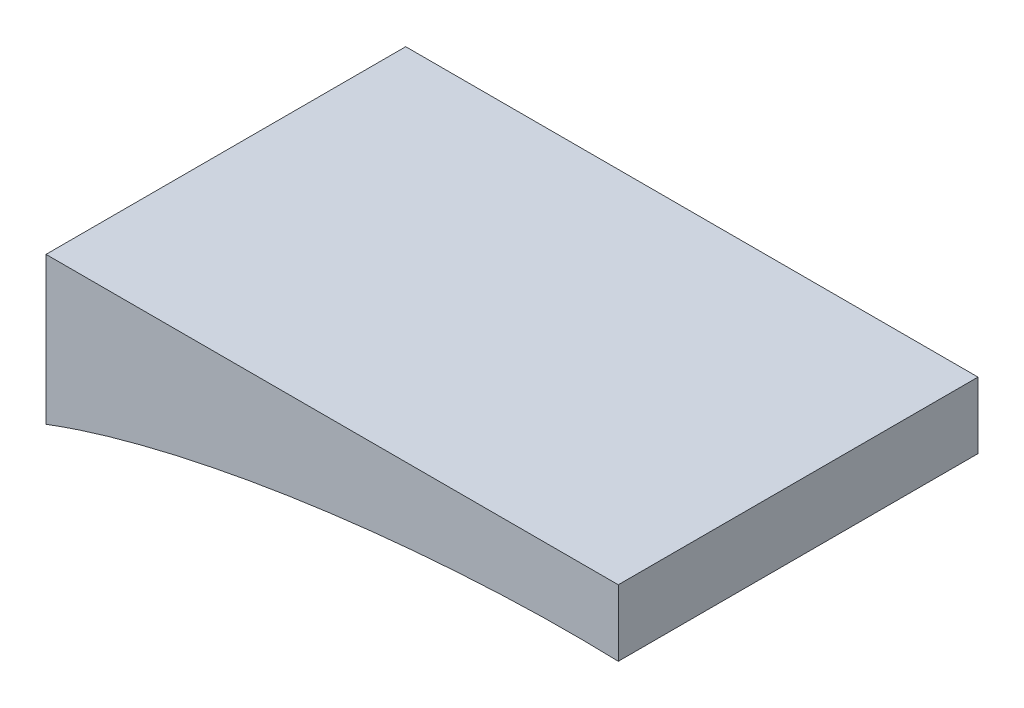
ISO-10303-21;
HEADER;
FILE_DESCRIPTION(('STEP AP214'),'2;1');
FILE_NAME('part.step','',(''),(''),'','','');
FILE_SCHEMA(('AUTOMOTIVE_DESIGN { 1 0 10303 214 1 1 1 1 }'));
ENDSEC;
DATA;
#1=APPLICATION_CONTEXT('core data for automotive mechanical design processes');
#2=APPLICATION_PROTOCOL_DEFINITION('international standard','automotive_design',2000,#1);
#3=PRODUCT_CONTEXT('',#1,'mechanical');
#4=PRODUCT('Part','Part','',(#3));
#5=PRODUCT_RELATED_PRODUCT_CATEGORY('part','',(#4));
#6=PRODUCT_DEFINITION_FORMATION('','',#4);
#7=PRODUCT_DEFINITION_CONTEXT('part definition',#1,'design');
#8=PRODUCT_DEFINITION('design','',#6,#7);
#9=PRODUCT_DEFINITION_SHAPE('','',#8);
#10=(LENGTH_UNIT() NAMED_UNIT(*) SI_UNIT(.MILLI.,.METRE.));
#11=(NAMED_UNIT(*) PLANE_ANGLE_UNIT() SI_UNIT($,.RADIAN.));
#12=(NAMED_UNIT(*) SI_UNIT($,.STERADIAN.) SOLID_ANGLE_UNIT());
#13=UNCERTAINTY_MEASURE_WITH_UNIT(LENGTH_MEASURE(1.E-05),#10,'distance_accuracy_value','');
#14=(GEOMETRIC_REPRESENTATION_CONTEXT(3) GLOBAL_UNCERTAINTY_ASSIGNED_CONTEXT((#13)) GLOBAL_UNIT_ASSIGNED_CONTEXT((#10,
#11,#12)) REPRESENTATION_CONTEXT('',''));
#15=CARTESIAN_POINT('',(0.,0.,0.));
#16=DIRECTION('',(0.,0.,1.));
#17=DIRECTION('',(1.,0.,0.));
#18=AXIS2_PLACEMENT_3D('',#15,#16,#17);
#19=CARTESIAN_POINT('',(100.,0.,22.));
#20=CARTESIAN_POINT('',(99.9998156509364,0.00219446047422512,22.));
#21=CARTESIAN_POINT('',(99.2960842626716,0.199325453500861,22.));
#22=CARTESIAN_POINT('',(98.619126090181,0.462023876152651,22.));
#23=CARTESIAN_POINT('',(97.0519039246836,1.04727160403521,22.));
#24=CARTESIAN_POINT('',(95.2308905611427,1.75489356170313,22.));
#25=CARTESIAN_POINT('',(92.9377883999997,2.55682262406311,22.));
#26=CARTESIAN_POINT('',(90.253595209805,3.33364669556734,22.));
#27=CARTESIAN_POINT('',(87.1476900902541,4.08159171713816,22.));
#28=CARTESIAN_POINT('',(83.6534535233071,4.84489294939738,22.));
#29=CARTESIAN_POINT('',(79.8050922783782,5.61262478938947,22.));
#30=CARTESIAN_POINT('',(75.655096386502,6.37817808174266,22.));
#31=CARTESIAN_POINT('',(71.2567750371295,7.1284211866885,22.));
#32=CARTESIAN_POINT('',(66.666591083815,7.84840862271711,22.));
#33=CARTESIAN_POINT('',(61.9422839876976,8.52124758203348,22.));
#34=CARTESIAN_POINT('',(57.1419916643488,9.12693532573033,22.));
#35=CARTESIAN_POINT('',(52.323298642329,9.64474489105086,22.));
#36=CARTESIAN_POINT('',(47.5421716345123,10.0466640945718,22.));
#37=CARTESIAN_POINT('',(42.8474128029864,10.315684788252,22.));
#38=CARTESIAN_POINT('',(38.2508590129801,10.3642373294133,22.));
#39=CARTESIAN_POINT('',(33.7665276305067,10.1858911603955,22.));
#40=CARTESIAN_POINT('',(29.4045407708241,9.85997953714068,22.));
#41=CARTESIAN_POINT('',(25.2056649179358,9.39633512244868,22.));
#42=CARTESIAN_POINT('',(21.2146329907838,8.8144764045113,22.));
#43=CARTESIAN_POINT('',(17.4732446171012,8.1296160960892,22.));
#44=CARTESIAN_POINT('',(14.0211027582914,7.35573873136707,22.));
#45=CARTESIAN_POINT('',(10.8931582983243,6.51004692488731,22.));
#46=CARTESIAN_POINT('',(8.12105740544501,5.60393899966372,22.));
#47=CARTESIAN_POINT('',(5.72962128075727,4.65858741987797,22.));
#48=CARTESIAN_POINT('',(3.73923883469922,3.68648252328311,22.));
#49=CARTESIAN_POINT('',(2.16290246553349,2.7162203503899,22.));
#50=CARTESIAN_POINT('',(1.00570220870081,1.76706228606803,22.));
#51=CARTESIAN_POINT('',(0.309881960884571,0.924053982718984,22.));
#52=CARTESIAN_POINT('',(0.0335623921127855,0.326864353298448,22.));
#53=CARTESIAN_POINT('',(0.000585058116756481,0.0590038319263769,22.));
#54=CARTESIAN_POINT('',(-0.000483324983572626,-0.0440553241565624,22.));
#55=CARTESIAN_POINT('',(0.00865655897641351,-0.147243842502105,22.));
#56=CARTESIAN_POINT('',(0.0976282148568061,-0.280738124086119,22.));
#57=CARTESIAN_POINT('',(0.217608326128965,-0.405627953622076,22.));
#58=CARTESIAN_POINT('',(0.606875055443502,-0.718520626599694,22.));
#59=CARTESIAN_POINT('',(1.51559341786082,-1.12387327993518,22.));
#60=CARTESIAN_POINT('',(3.07046981339313,-1.58299009342535,22.));
#61=CARTESIAN_POINT('',(5.15233849940049,-2.00716949321887,22.));
#62=CARTESIAN_POINT('',(7.72794701733534,-2.39169430673582,22.));
#63=CARTESIAN_POINT('',(10.7758632965451,-2.74988409949245,22.));
#64=CARTESIAN_POINT('',(14.251074500167,-3.0772124799214,22.));
#65=CARTESIAN_POINT('',(18.0406711254402,-3.47731503088619,22.));
#66=CARTESIAN_POINT('',(22.0414420337869,-3.90671848397194,22.));
#67=CARTESIAN_POINT('',(26.2166070486292,-4.11714527589637,22.));
#68=CARTESIAN_POINT('',(30.5565431080733,-4.09828552455342,22.));
#69=CARTESIAN_POINT('',(35.1013576121924,-3.84756636440319,22.));
#70=CARTESIAN_POINT('',(39.8555023988524,-3.29289641824458,22.));
#71=CARTESIAN_POINT('',(44.8530991506936,-2.56969491725158,22.));
#72=CARTESIAN_POINT('',(50.0777012636411,-1.6972464384225,22.));
#73=CARTESIAN_POINT('',(55.4969123049525,-0.808938968845193,22.));
#74=CARTESIAN_POINT('',(61.0344922062606,0.0244295388678754,22.));
#75=CARTESIAN_POINT('',(66.590101657332,0.742311193644087,22.));
#76=CARTESIAN_POINT('',(72.0549098572649,1.30128235901618,22.));
#77=CARTESIAN_POINT('',(77.3167133755177,1.67284440771095,22.));
#78=CARTESIAN_POINT('',(82.2607602188363,1.84173134146527,22.));
#79=CARTESIAN_POINT('',(86.7783991437203,1.81199551851271,22.));
#80=CARTESIAN_POINT('',(90.7288565877818,1.57974732032689,22.));
#81=CARTESIAN_POINT('',(94.0476487496997,1.18199750532775,22.));
#82=CARTESIAN_POINT('',(96.5243329790301,0.771531232095096,22.));
#83=CARTESIAN_POINT('',(98.4760244929446,0.356901303304398,22.));
#84=CARTESIAN_POINT('',(99.257250669849,0.188333084200799,22.));
#85=CARTESIAN_POINT('',(100.000186154411,-0.00221595103086352,22.));
#86=CARTESIAN_POINT('',(100.,0.,22.));
#87=B_SPLINE_CURVE_WITH_KNOTS('',3,(#19,#20,#21,#22,#23,#24,#25,#26,#27,#28,#29,#30,#31,#32,#33,
#34,#35,#36,#37,#38,#39,#40,#41,#42,#43,#44,#45,#46,#47,#48,#49,#50,#51,#52,#53,#54,#55,#56,#57,
#58,#59,#60,#61,#62,#63,#64,#65,#66,#67,#68,#69,#70,#71,#72,#73,#74,#75,#76,#77,#78,#79,#80,#81,
#82,#83,#84,#85,#86),.UNSPECIFIED.,.T.,.F.,(4,1,1,1,1,1,1,1,1,1,1,1,1,1,1,1,1,1,1,1,1,1,1,1,1,1,
1,1,1,1,1,1,1,1,1,1,1,1,1,1,1,1,1,1,1,1,1,1,1,1,1,1,1,1,1,1,1,1,1,1,1,1,1,1,1,4),(0.,
0.00170934634356601,0.00665456907472903,0.0143478493466078,0.0242594017057008,
0.0360417113890698,0.0496411159070593,0.0652547122672095,0.0827925347805582,0.102030591413806,
0.122721355866262,0.144596581278119,0.167375108700504,0.19076763878564,0.214482745024348,
0.238232802588826,0.261741379201132,0.284746803493425,0.307088371297225,0.329034070783988,
0.350454747563366,0.371139118049059,0.39089001909001,0.409511982282434,0.426831343781302,
0.442689348385407,0.4569497130243,0.469522755711217,0.480321822491961,0.489349766891022,
0.496580446347408,0.502134718441263,0.505253956973586,0.506016052269303,0.506062920949655,
0.506764306428777,0.507485535157146,0.508355903878622,0.509303966916285,0.514776147768379,
0.522722026188772,0.533080485530412,0.545839740853263,0.560863122591566,0.578017517003329,
0.596961029849698,0.616674639918331,0.636937396473689,0.6581483458223,0.68021144509927,
0.703561467075347,0.728221439111702,0.754163513980227,0.781135914110858,0.808648743307018,
0.836174178106489,0.863169877369038,0.889092096600814,0.913409262200501,0.935618429663885,
0.955186622460157,0.971480112027089,0.984125393112693,0.993028694310693,0.998273913867842,1.),.UNSPECIFIED.);
#88=DIRECTION('',(0.,0.,-1.));
#89=VECTOR('',#88,1.);
#90=SURFACE_OF_LINEAR_EXTRUSION('',#87,#89);
#91=CARTESIAN_POINT('',(100.,0.,0.));
#92=CARTESIAN_POINT('',(99.9998156509364,0.00219446047422512,0.));
#93=CARTESIAN_POINT('',(99.2960842626716,0.199325453500861,0.));
#94=CARTESIAN_POINT('',(98.619126090181,0.462023876152651,0.));
#95=CARTESIAN_POINT('',(97.0519039246836,1.04727160403521,0.));
#96=CARTESIAN_POINT('',(95.2308905611427,1.75489356170313,0.));
#97=CARTESIAN_POINT('',(92.9377883999997,2.55682262406311,0.));
#98=CARTESIAN_POINT('',(90.253595209805,3.33364669556734,0.));
#99=CARTESIAN_POINT('',(87.1476900902541,4.08159171713816,0.));
#100=CARTESIAN_POINT('',(83.6534535233071,4.84489294939738,0.));
#101=CARTESIAN_POINT('',(79.8050922783782,5.61262478938947,0.));
#102=CARTESIAN_POINT('',(75.655096386502,6.37817808174266,0.));
#103=CARTESIAN_POINT('',(71.2567750371295,7.1284211866885,0.));
#104=CARTESIAN_POINT('',(66.666591083815,7.84840862271711,0.));
#105=CARTESIAN_POINT('',(61.9422839876976,8.52124758203348,0.));
#106=CARTESIAN_POINT('',(57.1419916643488,9.12693532573033,0.));
#107=CARTESIAN_POINT('',(52.323298642329,9.64474489105086,0.));
#108=CARTESIAN_POINT('',(47.5421716345123,10.0466640945718,0.));
#109=CARTESIAN_POINT('',(42.8474128029864,10.315684788252,0.));
#110=CARTESIAN_POINT('',(38.2508590129801,10.3642373294133,0.));
#111=CARTESIAN_POINT('',(33.7665276305067,10.1858911603955,0.));
#112=CARTESIAN_POINT('',(29.4045407708241,9.85997953714068,0.));
#113=CARTESIAN_POINT('',(25.2056649179358,9.39633512244868,0.));
#114=CARTESIAN_POINT('',(21.2146329907838,8.8144764045113,0.));
#115=CARTESIAN_POINT('',(17.4732446171012,8.1296160960892,0.));
#116=CARTESIAN_POINT('',(14.0211027582914,7.35573873136707,0.));
#117=CARTESIAN_POINT('',(10.8931582983243,6.51004692488731,0.));
#118=CARTESIAN_POINT('',(8.12105740544501,5.60393899966372,0.));
#119=CARTESIAN_POINT('',(5.72962128075727,4.65858741987797,0.));
#120=CARTESIAN_POINT('',(3.73923883469922,3.68648252328311,0.));
#121=CARTESIAN_POINT('',(2.16290246553349,2.7162203503899,0.));
#122=CARTESIAN_POINT('',(1.00570220870081,1.76706228606803,0.));
#123=CARTESIAN_POINT('',(0.309881960884571,0.924053982718984,0.));
#124=CARTESIAN_POINT('',(0.0335623921127855,0.326864353298448,0.));
#125=CARTESIAN_POINT('',(0.000585058116756481,0.0590038319263769,0.));
#126=CARTESIAN_POINT('',(-0.000483324983572626,-0.0440553241565624,0.));
#127=CARTESIAN_POINT('',(0.00865655897641351,-0.147243842502105,0.));
#128=CARTESIAN_POINT('',(0.0976282148568061,-0.280738124086119,0.));
#129=CARTESIAN_POINT('',(0.217608326128965,-0.405627953622076,0.));
#130=CARTESIAN_POINT('',(0.606875055443502,-0.718520626599694,0.));
#131=CARTESIAN_POINT('',(1.51559341786082,-1.12387327993518,0.));
#132=CARTESIAN_POINT('',(3.07046981339313,-1.58299009342535,0.));
#133=CARTESIAN_POINT('',(5.15233849940049,-2.00716949321887,0.));
#134=CARTESIAN_POINT('',(7.72794701733534,-2.39169430673582,0.));
#135=CARTESIAN_POINT('',(10.7758632965451,-2.74988409949245,0.));
#136=CARTESIAN_POINT('',(14.251074500167,-3.0772124799214,0.));
#137=CARTESIAN_POINT('',(18.0406711254402,-3.47731503088619,0.));
#138=CARTESIAN_POINT('',(22.0414420337869,-3.90671848397194,0.));
#139=CARTESIAN_POINT('',(26.2166070486292,-4.11714527589637,0.));
#140=CARTESIAN_POINT('',(30.5565431080733,-4.09828552455342,0.));
#141=CARTESIAN_POINT('',(35.1013576121924,-3.84756636440319,0.));
#142=CARTESIAN_POINT('',(39.8555023988524,-3.29289641824458,0.));
#143=CARTESIAN_POINT('',(44.8530991506936,-2.56969491725158,0.));
#144=CARTESIAN_POINT('',(50.0777012636411,-1.6972464384225,0.));
#145=CARTESIAN_POINT('',(55.4969123049525,-0.808938968845193,0.));
#146=CARTESIAN_POINT('',(61.0344922062606,0.0244295388678754,0.));
#147=CARTESIAN_POINT('',(66.590101657332,0.742311193644087,0.));
#148=CARTESIAN_POINT('',(72.0549098572649,1.30128235901618,0.));
#149=CARTESIAN_POINT('',(77.3167133755177,1.67284440771095,0.));
#150=CARTESIAN_POINT('',(82.2607602188363,1.84173134146527,0.));
#151=CARTESIAN_POINT('',(86.7783991437203,1.81199551851271,0.));
#152=CARTESIAN_POINT('',(90.7288565877818,1.57974732032689,0.));
#153=CARTESIAN_POINT('',(94.0476487496997,1.18199750532775,0.));
#154=CARTESIAN_POINT('',(96.5243329790301,0.771531232095096,0.));
#155=CARTESIAN_POINT('',(98.4760244929446,0.356901303304398,0.));
#156=CARTESIAN_POINT('',(99.257250669849,0.188333084200799,0.));
#157=CARTESIAN_POINT('',(100.000186154411,-0.00221595103086352,0.));
#158=CARTESIAN_POINT('',(100.,0.,0.));
#159=B_SPLINE_CURVE_WITH_KNOTS('',3,(#91,#92,#93,#94,#95,#96,#97,#98,#99,#100,#101,#102,#103,
#104,#105,#106,#107,#108,#109,#110,#111,#112,#113,#114,#115,#116,#117,#118,#119,#120,#121,#122,
#123,#124,#125,#126,#127,#128,#129,#130,#131,#132,#133,#134,#135,#136,#137,#138,#139,#140,#141,
#142,#143,#144,#145,#146,#147,#148,#149,#150,#151,#152,#153,#154,#155,#156,#157,#158),
.UNSPECIFIED.,.T.,.F.,(4,1,1,1,1,1,1,1,1,1,1,1,1,1,1,1,1,1,1,1,1,1,1,1,1,1,1,1,1,1,1,1,1,1,1,1,
1,1,1,1,1,1,1,1,1,1,1,1,1,1,1,1,1,1,1,1,1,1,1,1,1,1,1,1,1,4),(0.,0.00170934634356601,
0.00665456907472903,0.0143478493466078,0.0242594017057008,0.0360417113890698,0.0496411159070593,
0.0652547122672095,0.0827925347805582,0.102030591413806,0.122721355866262,0.144596581278119,
0.167375108700504,0.19076763878564,0.214482745024348,0.238232802588826,0.261741379201132,
0.284746803493425,0.307088371297225,0.329034070783988,0.350454747563366,0.371139118049059,
0.39089001909001,0.409511982282434,0.426831343781302,0.442689348385407,0.4569497130243,
0.469522755711217,0.480321822491961,0.489349766891022,0.496580446347408,0.502134718441263,
0.505253956973586,0.506016052269303,0.506062920949655,0.506764306428777,0.507485535157146,
0.508355903878622,0.509303966916285,0.514776147768379,0.522722026188772,0.533080485530412,
0.545839740853263,0.560863122591566,0.578017517003329,0.596961029849698,0.616674639918331,
0.636937396473689,0.6581483458223,0.68021144509927,0.703561467075347,0.728221439111702,
0.754163513980227,0.781135914110858,0.808648743307018,0.836174178106489,0.863169877369038,
0.889092096600814,0.913409262200501,0.935618429663885,0.955186622460157,0.971480112027089,
0.984125393112693,0.993028694310693,0.998273913867842,1.),.UNSPECIFIED.);
#160=CARTESIAN_POINT('',(42.5,10.290738099389,0.));
#161=VERTEX_POINT('',#160);
#162=CARTESIAN_POINT('',(7.5,5.34542756342136,0.));
#163=VERTEX_POINT('',#162);
#164=EDGE_CURVE('E109',#161,#163,#159,.T.);
#165=ORIENTED_EDGE('',*,*,#164,.F.);
#166=DIRECTION('',(0.,0.,-1.));
#167=VECTOR('',#166,1.);
#168=CARTESIAN_POINT('',(42.5,10.290738099389,22.));
#169=LINE('',#168,#167);
#170=CARTESIAN_POINT('',(42.5,10.290738099389,22.));
#171=VERTEX_POINT('',#170);
#172=EDGE_CURVE('E11',#171,#161,#169,.T.);
#173=ORIENTED_EDGE('',*,*,#172,.F.);
#174=CARTESIAN_POINT('',(7.5,5.34542756342136,22.));
#175=VERTEX_POINT('',#174);
#176=EDGE_CURVE('E99',#171,#175,#87,.T.);
#177=ORIENTED_EDGE('',*,*,#176,.T.);
#178=DIRECTION('',(0.,0.,-1.));
#179=VECTOR('',#178,1.);
#180=CARTESIAN_POINT('',(7.5,5.34542756342136,22.));
#181=LINE('',#180,#179);
#182=EDGE_CURVE('E59',#175,#163,#181,.T.);
#183=ORIENTED_EDGE('',*,*,#182,.T.);
#184=EDGE_LOOP('',(#165,#173,#177,#183));
#185=FACE_BOUND('',#184,.T.);
#186=ADVANCED_FACE('F41',(#185),#90,.T.);
#187=CARTESIAN_POINT('',(42.5,1.45462676504345E-13,22.));
#188=DIRECTION('',(1.,0.,0.));
#189=DIRECTION('',(0.,1.,0.));
#190=AXIS2_PLACEMENT_3D('',#187,#188,#189);
#191=PLANE('',#190);
#192=DIRECTION('',(0.,-1.,0.));
#193=VECTOR('',#192,1.);
#194=CARTESIAN_POINT('',(42.5,1.45462676504345E-13,0.));
#195=LINE('',#194,#193);
#196=CARTESIAN_POINT('',(42.5,14.3454275634214,0.));
#197=VERTEX_POINT('',#196);
#198=EDGE_CURVE('E89',#197,#161,#195,.T.);
#199=ORIENTED_EDGE('',*,*,#198,.F.);
#200=DIRECTION('',(0.,0.,-1.));
#201=VECTOR('',#200,1.);
#202=CARTESIAN_POINT('',(42.5,14.3454275634214,22.));
#203=LINE('',#202,#201);
#204=CARTESIAN_POINT('',(42.5,14.3454275634214,22.));
#205=VERTEX_POINT('',#204);
#206=EDGE_CURVE('E51',#205,#197,#203,.T.);
#207=ORIENTED_EDGE('',*,*,#206,.F.);
#208=DIRECTION('',(0.,-1.,0.));
#209=VECTOR('',#208,1.);
#210=CARTESIAN_POINT('',(42.5,1.45462676504345E-13,22.));
#211=LINE('',#210,#209);
#212=EDGE_CURVE('E87',#205,#171,#211,.T.);
#213=ORIENTED_EDGE('',*,*,#212,.T.);
#214=ORIENTED_EDGE('',*,*,#172,.T.);
#215=EDGE_LOOP('',(#199,#207,#213,#214));
#216=FACE_BOUND('',#215,.T.);
#217=ADVANCED_FACE('F86',(#216),#191,.T.);
#218=CARTESIAN_POINT('',(0.,14.3454275634214,22.));
#219=DIRECTION('',(0.,1.,0.));
#220=DIRECTION('',(0.,0.,1.));
#221=AXIS2_PLACEMENT_3D('',#218,#219,#220);
#222=PLANE('',#221);
#223=DIRECTION('',(1.,0.,0.));
#224=VECTOR('',#223,1.);
#225=CARTESIAN_POINT('',(0.,14.3454275634214,0.));
#226=LINE('',#225,#224);
#227=CARTESIAN_POINT('',(7.5,14.3454275634214,0.));
#228=VERTEX_POINT('',#227);
#229=EDGE_CURVE('E119',#228,#197,#226,.T.);
#230=ORIENTED_EDGE('',*,*,#229,.F.);
#231=DIRECTION('',(0.,0.,-1.));
#232=VECTOR('',#231,1.);
#233=CARTESIAN_POINT('',(7.5,14.3454275634214,22.));
#234=LINE('',#233,#232);
#235=CARTESIAN_POINT('',(7.5,14.3454275634214,22.));
#236=VERTEX_POINT('',#235);
#237=EDGE_CURVE('E72',#236,#228,#234,.T.);
#238=ORIENTED_EDGE('',*,*,#237,.F.);
#239=DIRECTION('',(1.,0.,0.));
#240=VECTOR('',#239,1.);
#241=CARTESIAN_POINT('',(0.,14.3454275634214,22.));
#242=LINE('',#241,#240);
#243=EDGE_CURVE('E98',#236,#205,#242,.T.);
#244=ORIENTED_EDGE('',*,*,#243,.T.);
#245=ORIENTED_EDGE('',*,*,#206,.T.);
#246=EDGE_LOOP('',(#230,#238,#244,#245));
#247=FACE_BOUND('',#246,.T.);
#248=ADVANCED_FACE('F102',(#247),#222,.T.);
#249=CARTESIAN_POINT('',(7.5,0.,22.));
#250=DIRECTION('',(-1.,0.,0.));
#251=DIRECTION('',(0.,0.,1.));
#252=AXIS2_PLACEMENT_3D('',#249,#250,#251);
#253=PLANE('',#252);
#254=DIRECTION('',(0.,1.,0.));
#255=VECTOR('',#254,1.);
#256=CARTESIAN_POINT('',(7.5,0.,0.));
#257=LINE('',#256,#255);
#258=EDGE_CURVE('E122',#163,#228,#257,.T.);
#259=ORIENTED_EDGE('',*,*,#258,.F.);
#260=ORIENTED_EDGE('',*,*,#182,.F.);
#261=DIRECTION('',(0.,1.,0.));
#262=VECTOR('',#261,1.);
#263=CARTESIAN_POINT('',(7.5,0.,22.));
#264=LINE('',#263,#262);
#265=EDGE_CURVE('E104',#175,#236,#264,.T.);
#266=ORIENTED_EDGE('',*,*,#265,.T.);
#267=ORIENTED_EDGE('',*,*,#237,.T.);
#268=EDGE_LOOP('',(#259,#260,#266,#267));
#269=FACE_BOUND('',#268,.T.);
#270=ADVANCED_FACE('F137',(#269),#253,.T.);
#271=CARTESIAN_POINT('',(0.,0.,22.));
#272=DIRECTION('',(0.,0.,1.));
#273=DIRECTION('',(1.,0.,0.));
#274=AXIS2_PLACEMENT_3D('',#271,#272,#273);
#275=PLANE('',#274);
#276=ORIENTED_EDGE('',*,*,#176,.F.);
#277=ORIENTED_EDGE('',*,*,#212,.F.);
#278=ORIENTED_EDGE('',*,*,#243,.F.);
#279=ORIENTED_EDGE('',*,*,#265,.F.);
#280=EDGE_LOOP('',(#276,#277,#278,#279));
#281=FACE_BOUND('',#280,.T.);
#282=ADVANCED_FACE('F96',(#281),#275,.T.);
#283=CARTESIAN_POINT('',(0.,0.,0.));
#284=DIRECTION('',(0.,0.,1.));
#285=DIRECTION('',(1.,0.,0.));
#286=AXIS2_PLACEMENT_3D('',#283,#284,#285);
#287=PLANE('',#286);
#288=ORIENTED_EDGE('',*,*,#164,.T.);
#289=ORIENTED_EDGE('',*,*,#258,.T.);
#290=ORIENTED_EDGE('',*,*,#229,.T.);
#291=ORIENTED_EDGE('',*,*,#198,.T.);
#292=EDGE_LOOP('',(#288,#289,#290,#291));
#293=FACE_BOUND('',#292,.T.);
#294=ADVANCED_FACE('F144',(#293),#287,.F.);
#295=CLOSED_SHELL('',(#186,#217,#248,#270,#282,#294));
#296=MANIFOLD_SOLID_BREP('B2',#295);
#297=ADVANCED_BREP_SHAPE_REPRESENTATION('',(#18,#296),#14);
#298=SHAPE_DEFINITION_REPRESENTATION(#9,#297);
ENDSEC;
END-ISO-10303-21;
